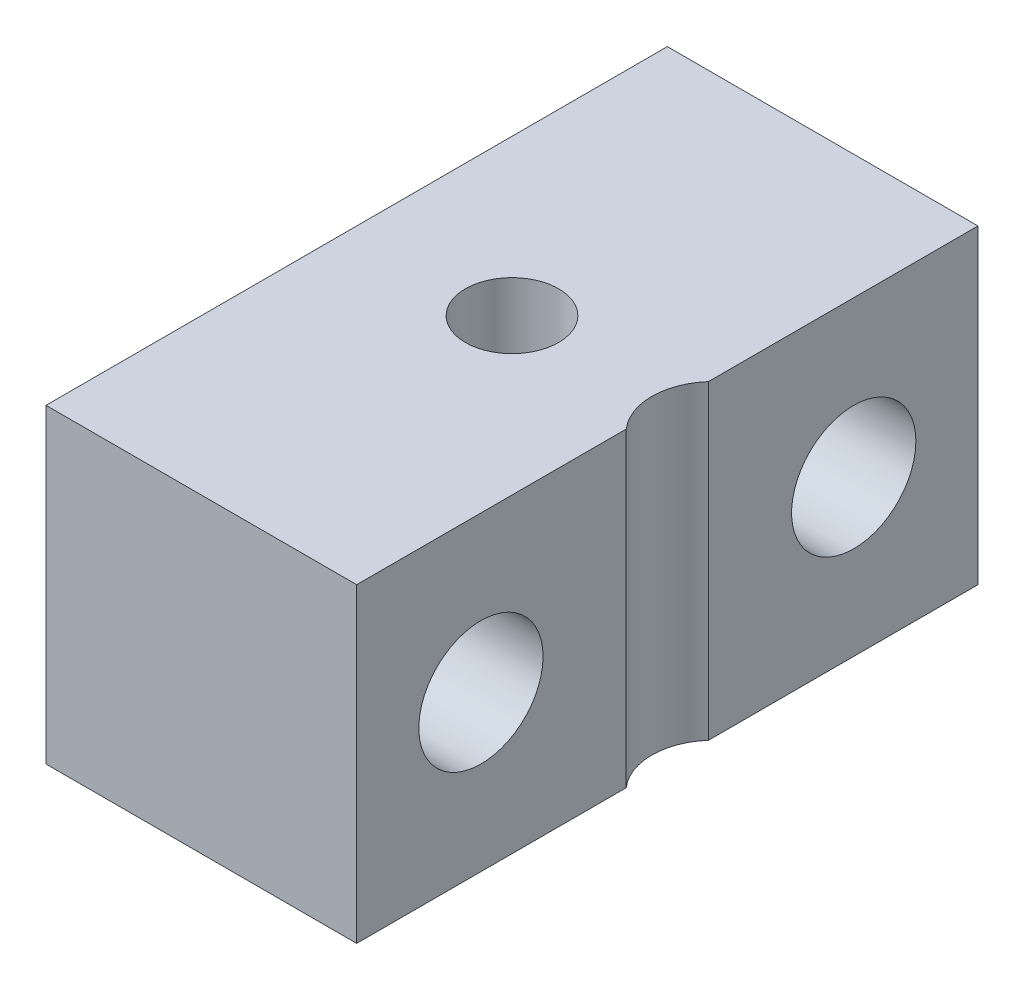
ISO-10303-21;
HEADER;
FILE_DESCRIPTION(('STEP AP214'),'2;1');
FILE_NAME('part.step','',(''),(''),'','','');
FILE_SCHEMA(('AUTOMOTIVE_DESIGN { 1 0 10303 214 1 1 1 1 }'));
ENDSEC;
DATA;
#1=APPLICATION_CONTEXT('core data for automotive mechanical design processes');
#2=APPLICATION_PROTOCOL_DEFINITION('international standard','automotive_design',2000,#1);
#3=PRODUCT_CONTEXT('',#1,'mechanical');
#4=PRODUCT('Part','Part','',(#3));
#5=PRODUCT_RELATED_PRODUCT_CATEGORY('part','',(#4));
#6=PRODUCT_DEFINITION_FORMATION('','',#4);
#7=PRODUCT_DEFINITION_CONTEXT('part definition',#1,'design');
#8=PRODUCT_DEFINITION('design','',#6,#7);
#9=PRODUCT_DEFINITION_SHAPE('','',#8);
#10=(LENGTH_UNIT() NAMED_UNIT(*) SI_UNIT(.MILLI.,.METRE.));
#11=(NAMED_UNIT(*) PLANE_ANGLE_UNIT() SI_UNIT($,.RADIAN.));
#12=(NAMED_UNIT(*) SI_UNIT($,.STERADIAN.) SOLID_ANGLE_UNIT());
#13=UNCERTAINTY_MEASURE_WITH_UNIT(LENGTH_MEASURE(1.E-05),#10,'distance_accuracy_value','');
#14=(GEOMETRIC_REPRESENTATION_CONTEXT(3) GLOBAL_UNCERTAINTY_ASSIGNED_CONTEXT((#13)) GLOBAL_UNIT_ASSIGNED_CONTEXT((#10,
#11,#12)) REPRESENTATION_CONTEXT('',''));
#15=CARTESIAN_POINT('',(0.,0.,0.));
#16=DIRECTION('',(0.,0.,1.));
#17=DIRECTION('',(1.,0.,0.));
#18=AXIS2_PLACEMENT_3D('',#15,#16,#17);
#19=CARTESIAN_POINT('',(11.5,10.,-10.));
#20=DIRECTION('',(0.,-1.,0.));
#21=DIRECTION('',(0.,0.,-1.));
#22=AXIS2_PLACEMENT_3D('',#19,#20,#21);
#23=CYLINDRICAL_SURFACE('',#22,2.);
#24=CARTESIAN_POINT('',(11.5,0.,-10.));
#25=DIRECTION('',(0.,1.,0.));
#26=DIRECTION('',(0.,0.,1.));
#27=AXIS2_PLACEMENT_3D('',#24,#25,#26);
#28=CIRCLE('',#27,2.);
#29=CARTESIAN_POINT('',(10.,0.,-11.3228756555323));
#30=VERTEX_POINT('',#29);
#31=CARTESIAN_POINT('',(10.,0.,-8.67712434446771));
#32=VERTEX_POINT('',#31);
#33=EDGE_CURVE('E134',#30,#32,#28,.T.);
#34=ORIENTED_EDGE('',*,*,#33,.F.);
#35=DIRECTION('',(0.,-1.,0.));
#36=VECTOR('',#35,1.);
#37=CARTESIAN_POINT('',(10.,10.,-11.3228756555323));
#38=LINE('',#37,#36);
#39=CARTESIAN_POINT('',(10.,10.,-11.3228756555323));
#40=VERTEX_POINT('',#39);
#41=EDGE_CURVE('E11',#40,#30,#38,.T.);
#42=ORIENTED_EDGE('',*,*,#41,.F.);
#43=CARTESIAN_POINT('',(11.5,10.,-10.));
#44=DIRECTION('',(0.,1.,0.));
#45=DIRECTION('',(0.,0.,1.));
#46=AXIS2_PLACEMENT_3D('',#43,#44,#45);
#47=CIRCLE('',#46,2.);
#48=CARTESIAN_POINT('',(10.,10.,-8.67712434446771));
#49=VERTEX_POINT('',#48);
#50=EDGE_CURVE('E176',#40,#49,#47,.T.);
#51=ORIENTED_EDGE('',*,*,#50,.T.);
#52=DIRECTION('',(0.,-1.,0.));
#53=VECTOR('',#52,1.);
#54=CARTESIAN_POINT('',(10.,10.,-8.67712434446771));
#55=LINE('',#54,#53);
#56=EDGE_CURVE('E93',#49,#32,#55,.T.);
#57=ORIENTED_EDGE('',*,*,#56,.T.);
#58=EDGE_LOOP('',(#34,#42,#51,#57));
#59=FACE_BOUND('',#58,.T.);
#60=ADVANCED_FACE('F46',(#59),#23,.F.);
#61=CARTESIAN_POINT('',(10.,10.,0.));
#62=DIRECTION('',(-1.,0.,0.));
#63=DIRECTION('',(0.,0.,1.));
#64=AXIS2_PLACEMENT_3D('',#61,#62,#63);
#65=PLANE('',#64);
#66=CARTESIAN_POINT('',(10.,5.,-16.));
#67=DIRECTION('',(1.,0.,0.));
#68=DIRECTION('',(0.,0.,-1.));
#69=AXIS2_PLACEMENT_3D('',#66,#67,#68);
#70=CIRCLE('',#69,2.);
#71=CARTESIAN_POINT('',(10.,5.,-18.));
#72=VERTEX_POINT('',#71);
#73=EDGE_CURVE('E172',#72,#72,#70,.T.);
#74=ORIENTED_EDGE('',*,*,#73,.F.);
#75=EDGE_LOOP('',(#74));
#76=FACE_BOUND('',#75,.T.);
#77=DIRECTION('',(0.,0.,-1.));
#78=VECTOR('',#77,1.);
#79=CARTESIAN_POINT('',(10.,0.,0.));
#80=LINE('',#79,#78);
#81=CARTESIAN_POINT('',(10.,0.,-20.));
#82=VERTEX_POINT('',#81);
#83=EDGE_CURVE('E138',#30,#82,#80,.T.);
#84=ORIENTED_EDGE('',*,*,#83,.T.);
#85=DIRECTION('',(0.,-1.,0.));
#86=VECTOR('',#85,1.);
#87=CARTESIAN_POINT('',(10.,10.,-20.));
#88=LINE('',#87,#86);
#89=CARTESIAN_POINT('',(10.,10.,-20.));
#90=VERTEX_POINT('',#89);
#91=EDGE_CURVE('E56',#90,#82,#88,.T.);
#92=ORIENTED_EDGE('',*,*,#91,.F.);
#93=DIRECTION('',(0.,0.,-1.));
#94=VECTOR('',#93,1.);
#95=CARTESIAN_POINT('',(10.,10.,0.));
#96=LINE('',#95,#94);
#97=EDGE_CURVE('E130',#40,#90,#96,.T.);
#98=ORIENTED_EDGE('',*,*,#97,.F.);
#99=ORIENTED_EDGE('',*,*,#41,.T.);
#100=EDGE_LOOP('',(#84,#92,#98,#99));
#101=FACE_BOUND('',#100,.T.);
#102=ADVANCED_FACE('F182',(#76,#101),#65,.F.);
#103=CARTESIAN_POINT('',(0.,10.,-20.));
#104=DIRECTION('',(0.,0.,-1.));
#105=DIRECTION('',(-1.,0.,0.));
#106=AXIS2_PLACEMENT_3D('',#103,#104,#105);
#107=PLANE('',#106);
#108=DIRECTION('',(1.,0.,0.));
#109=VECTOR('',#108,1.);
#110=CARTESIAN_POINT('',(0.,0.,-20.));
#111=LINE('',#110,#109);
#112=CARTESIAN_POINT('',(0.,0.,-20.));
#113=VERTEX_POINT('',#112);
#114=EDGE_CURVE('E143',#113,#82,#111,.T.);
#115=ORIENTED_EDGE('',*,*,#114,.F.);
#116=DIRECTION('',(0.,-1.,0.));
#117=VECTOR('',#116,1.);
#118=CARTESIAN_POINT('',(0.,10.,-20.));
#119=LINE('',#118,#117);
#120=CARTESIAN_POINT('',(0.,10.,-20.));
#121=VERTEX_POINT('',#120);
#122=EDGE_CURVE('E116',#121,#113,#119,.T.);
#123=ORIENTED_EDGE('',*,*,#122,.F.);
#124=DIRECTION('',(1.,0.,0.));
#125=VECTOR('',#124,1.);
#126=CARTESIAN_POINT('',(0.,10.,-20.));
#127=LINE('',#126,#125);
#128=EDGE_CURVE('E126',#121,#90,#127,.T.);
#129=ORIENTED_EDGE('',*,*,#128,.T.);
#130=ORIENTED_EDGE('',*,*,#91,.T.);
#131=EDGE_LOOP('',(#115,#123,#129,#130));
#132=FACE_BOUND('',#131,.T.);
#133=ADVANCED_FACE('F186',(#132),#107,.T.);
#134=CARTESIAN_POINT('',(0.,10.,0.));
#135=DIRECTION('',(-1.,0.,0.));
#136=DIRECTION('',(0.,0.,1.));
#137=AXIS2_PLACEMENT_3D('',#134,#135,#136);
#138=PLANE('',#137);
#139=CARTESIAN_POINT('',(0.,5.,-4.));
#140=DIRECTION('',(-1.,0.,0.));
#141=DIRECTION('',(0.,0.,1.));
#142=AXIS2_PLACEMENT_3D('',#139,#140,#141);
#143=CIRCLE('',#142,2.);
#144=CARTESIAN_POINT('',(0.,5.,-2.));
#145=VERTEX_POINT('',#144);
#146=EDGE_CURVE('E161',#145,#145,#143,.T.);
#147=ORIENTED_EDGE('',*,*,#146,.F.);
#148=EDGE_LOOP('',(#147));
#149=FACE_BOUND('',#148,.T.);
#150=CARTESIAN_POINT('',(0.,5.,-16.));
#151=DIRECTION('',(-1.,0.,0.));
#152=DIRECTION('',(0.,0.,1.));
#153=AXIS2_PLACEMENT_3D('',#150,#151,#152);
#154=CIRCLE('',#153,2.);
#155=CARTESIAN_POINT('',(0.,5.,-14.));
#156=VERTEX_POINT('',#155);
#157=EDGE_CURVE('E139',#156,#156,#154,.T.);
#158=ORIENTED_EDGE('',*,*,#157,.F.);
#159=EDGE_LOOP('',(#158));
#160=FACE_BOUND('',#159,.T.);
#161=DIRECTION('',(0.,0.,-1.));
#162=VECTOR('',#161,1.);
#163=CARTESIAN_POINT('',(0.,0.,0.));
#164=LINE('',#163,#162);
#165=CARTESIAN_POINT('',(0.,0.,0.));
#166=VERTEX_POINT('',#165);
#167=EDGE_CURVE('E114',#166,#113,#164,.T.);
#168=ORIENTED_EDGE('',*,*,#167,.F.);
#169=DIRECTION('',(0.,-1.,0.));
#170=VECTOR('',#169,1.);
#171=CARTESIAN_POINT('',(0.,10.,0.));
#172=LINE('',#171,#170);
#173=CARTESIAN_POINT('',(0.,10.,0.));
#174=VERTEX_POINT('',#173);
#175=EDGE_CURVE('E108',#174,#166,#172,.T.);
#176=ORIENTED_EDGE('',*,*,#175,.F.);
#177=DIRECTION('',(0.,0.,-1.));
#178=VECTOR('',#177,1.);
#179=CARTESIAN_POINT('',(0.,10.,0.));
#180=LINE('',#179,#178);
#181=EDGE_CURVE('E112',#174,#121,#180,.T.);
#182=ORIENTED_EDGE('',*,*,#181,.T.);
#183=ORIENTED_EDGE('',*,*,#122,.T.);
#184=EDGE_LOOP('',(#168,#176,#182,#183));
#185=FACE_BOUND('',#184,.T.);
#186=ADVANCED_FACE('F110',(#149,#160,#185),#138,.T.);
#187=CARTESIAN_POINT('',(0.,10.,0.));
#188=DIRECTION('',(0.,0.,-1.));
#189=DIRECTION('',(-1.,0.,0.));
#190=AXIS2_PLACEMENT_3D('',#187,#188,#189);
#191=PLANE('',#190);
#192=DIRECTION('',(1.,0.,0.));
#193=VECTOR('',#192,1.);
#194=CARTESIAN_POINT('',(0.,0.,0.));
#195=LINE('',#194,#193);
#196=CARTESIAN_POINT('',(10.,0.,0.));
#197=VERTEX_POINT('',#196);
#198=EDGE_CURVE('E86',#166,#197,#195,.T.);
#199=ORIENTED_EDGE('',*,*,#198,.T.);
#200=DIRECTION('',(0.,-1.,0.));
#201=VECTOR('',#200,1.);
#202=CARTESIAN_POINT('',(10.,10.,0.));
#203=LINE('',#202,#201);
#204=CARTESIAN_POINT('',(10.,10.,0.));
#205=VERTEX_POINT('',#204);
#206=EDGE_CURVE('E117',#205,#197,#203,.T.);
#207=ORIENTED_EDGE('',*,*,#206,.F.);
#208=DIRECTION('',(1.,0.,0.));
#209=VECTOR('',#208,1.);
#210=CARTESIAN_POINT('',(0.,10.,0.));
#211=LINE('',#210,#209);
#212=EDGE_CURVE('E119',#174,#205,#211,.T.);
#213=ORIENTED_EDGE('',*,*,#212,.F.);
#214=ORIENTED_EDGE('',*,*,#175,.T.);
#215=EDGE_LOOP('',(#199,#207,#213,#214));
#216=FACE_BOUND('',#215,.T.);
#217=ADVANCED_FACE('F120',(#216),#191,.F.);
#218=CARTESIAN_POINT('',(10.,5.,-4.));
#219=DIRECTION('',(1.,0.,0.));
#220=DIRECTION('',(0.,0.,-1.));
#221=AXIS2_PLACEMENT_3D('',#218,#219,#220);
#222=CIRCLE('',#221,2.);
#223=CARTESIAN_POINT('',(10.,5.,-6.));
#224=VERTEX_POINT('',#223);
#225=EDGE_CURVE('E166',#224,#224,#222,.T.);
#226=ORIENTED_EDGE('',*,*,#225,.F.);
#227=EDGE_LOOP('',(#226));
#228=FACE_BOUND('',#227,.T.);
#229=EDGE_CURVE('E144',#197,#32,#80,.T.);
#230=ORIENTED_EDGE('',*,*,#229,.T.);
#231=ORIENTED_EDGE('',*,*,#56,.F.);
#232=EDGE_CURVE('E65',#205,#49,#96,.T.);
#233=ORIENTED_EDGE('',*,*,#232,.F.);
#234=ORIENTED_EDGE('',*,*,#206,.T.);
#235=EDGE_LOOP('',(#230,#231,#233,#234));
#236=FACE_BOUND('',#235,.T.);
#237=ADVANCED_FACE('F192',(#228,#236),#65,.F.);
#238=CARTESIAN_POINT('',(0.,10.,0.));
#239=DIRECTION('',(0.,1.,0.));
#240=DIRECTION('',(0.,0.,1.));
#241=AXIS2_PLACEMENT_3D('',#238,#239,#240);
#242=PLANE('',#241);
#243=CARTESIAN_POINT('',(5.,10.,-10.));
#244=DIRECTION('',(0.,1.,0.));
#245=DIRECTION('',(0.,0.,1.));
#246=AXIS2_PLACEMENT_3D('',#243,#244,#245);
#247=CIRCLE('',#246,1.5);
#248=CARTESIAN_POINT('',(5.,10.,-8.5));
#249=VERTEX_POINT('',#248);
#250=EDGE_CURVE('E235',#249,#249,#247,.T.);
#251=ORIENTED_EDGE('',*,*,#250,.F.);
#252=EDGE_LOOP('',(#251));
#253=FACE_BOUND('',#252,.T.);
#254=ORIENTED_EDGE('',*,*,#50,.F.);
#255=ORIENTED_EDGE('',*,*,#97,.T.);
#256=ORIENTED_EDGE('',*,*,#128,.F.);
#257=ORIENTED_EDGE('',*,*,#181,.F.);
#258=ORIENTED_EDGE('',*,*,#212,.T.);
#259=ORIENTED_EDGE('',*,*,#232,.T.);
#260=EDGE_LOOP('',(#254,#255,#256,#257,#258,#259));
#261=FACE_BOUND('',#260,.T.);
#262=ADVANCED_FACE('F124',(#253,#261),#242,.T.);
#263=CARTESIAN_POINT('',(0.,0.,0.));
#264=DIRECTION('',(0.,1.,0.));
#265=DIRECTION('',(0.,0.,1.));
#266=AXIS2_PLACEMENT_3D('',#263,#264,#265);
#267=PLANE('',#266);
#268=CARTESIAN_POINT('',(5.,0.,-10.));
#269=DIRECTION('',(0.,1.,0.));
#270=DIRECTION('',(0.,0.,1.));
#271=AXIS2_PLACEMENT_3D('',#268,#269,#270);
#272=CIRCLE('',#271,1.5);
#273=CARTESIAN_POINT('',(5.,0.,-8.5));
#274=VERTEX_POINT('',#273);
#275=EDGE_CURVE('E49',#274,#274,#272,.T.);
#276=ORIENTED_EDGE('',*,*,#275,.T.);
#277=EDGE_LOOP('',(#276));
#278=FACE_BOUND('',#277,.T.);
#279=ORIENTED_EDGE('',*,*,#33,.T.);
#280=ORIENTED_EDGE('',*,*,#229,.F.);
#281=ORIENTED_EDGE('',*,*,#198,.F.);
#282=ORIENTED_EDGE('',*,*,#167,.T.);
#283=ORIENTED_EDGE('',*,*,#114,.T.);
#284=ORIENTED_EDGE('',*,*,#83,.F.);
#285=EDGE_LOOP('',(#279,#280,#281,#282,#283,#284));
#286=FACE_BOUND('',#285,.T.);
#287=ADVANCED_FACE('F188',(#278,#286),#267,.F.);
#288=CARTESIAN_POINT('',(-9.,5.,-4.));
#289=DIRECTION('',(1.,0.,0.));
#290=DIRECTION('',(0.,0.,-1.));
#291=AXIS2_PLACEMENT_3D('',#288,#289,#290);
#292=CYLINDRICAL_SURFACE('',#291,2.);
#293=ORIENTED_EDGE('',*,*,#146,.T.);
#294=EDGE_LOOP('',(#293));
#295=FACE_BOUND('',#294,.T.);
#296=ORIENTED_EDGE('',*,*,#225,.T.);
#297=EDGE_LOOP('',(#296));
#298=FACE_BOUND('',#297,.T.);
#299=ADVANCED_FACE('F217',(#295,#298),#292,.F.);
#300=CARTESIAN_POINT('',(-9.,5.,-16.));
#301=DIRECTION('',(1.,0.,0.));
#302=DIRECTION('',(0.,0.,-1.));
#303=AXIS2_PLACEMENT_3D('',#300,#301,#302);
#304=CYLINDRICAL_SURFACE('',#303,2.);
#305=ORIENTED_EDGE('',*,*,#157,.T.);
#306=EDGE_LOOP('',(#305));
#307=FACE_BOUND('',#306,.T.);
#308=ORIENTED_EDGE('',*,*,#73,.T.);
#309=EDGE_LOOP('',(#308));
#310=FACE_BOUND('',#309,.T.);
#311=ADVANCED_FACE('F218',(#307,#310),#304,.F.);
#312=CARTESIAN_POINT('',(5.,-8.00000000000001,-10.));
#313=DIRECTION('',(0.,1.,0.));
#314=DIRECTION('',(0.,0.,1.));
#315=AXIS2_PLACEMENT_3D('',#312,#313,#314);
#316=CYLINDRICAL_SURFACE('',#315,1.5);
#317=ORIENTED_EDGE('',*,*,#250,.T.);
#318=EDGE_LOOP('',(#317));
#319=FACE_BOUND('',#318,.T.);
#320=ORIENTED_EDGE('',*,*,#275,.F.);
#321=EDGE_LOOP('',(#320));
#322=FACE_BOUND('',#321,.T.);
#323=ADVANCED_FACE('F223',(#319,#322),#316,.F.);
#324=CLOSED_SHELL('',(#60,#102,#133,#186,#217,#237,#262,#287,#299,#311,#323));
#325=MANIFOLD_SOLID_BREP('B2',#324);
#326=ADVANCED_BREP_SHAPE_REPRESENTATION('',(#18,#325),#14);
#327=SHAPE_DEFINITION_REPRESENTATION(#9,#326);
ENDSEC;
END-ISO-10303-21;
